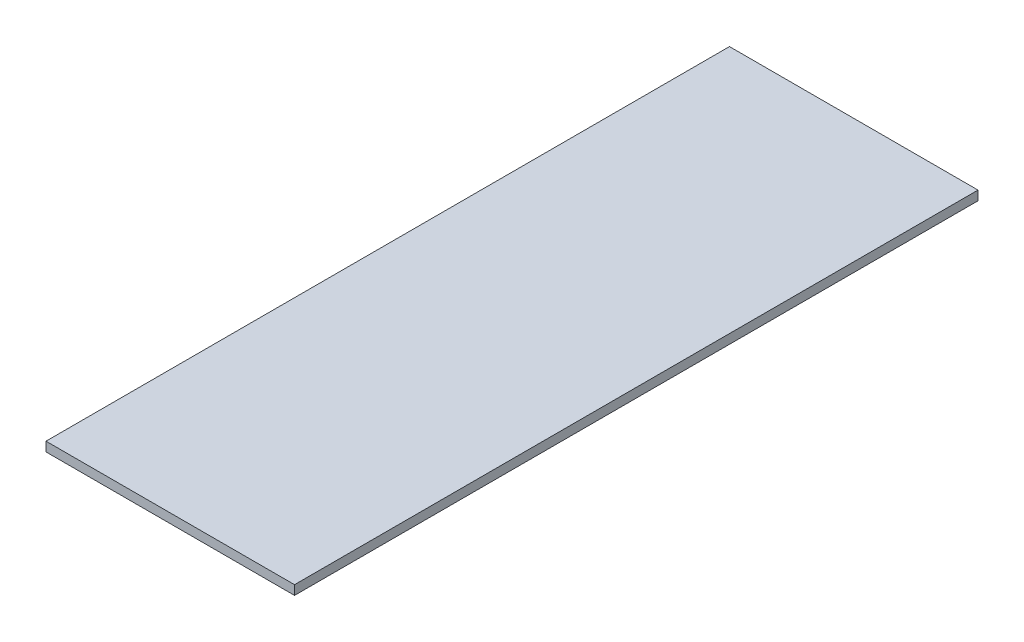
ISO-10303-21;
HEADER;
FILE_DESCRIPTION(('STEP AP214'),'2;1');
FILE_NAME('part.step','',(''),(''),'','','');
FILE_SCHEMA(('AUTOMOTIVE_DESIGN { 1 0 10303 214 1 1 1 1 }'));
ENDSEC;
DATA;
#1=APPLICATION_CONTEXT('core data for automotive mechanical design processes');
#2=APPLICATION_PROTOCOL_DEFINITION('international standard','automotive_design',2000,#1);
#3=PRODUCT_CONTEXT('',#1,'mechanical');
#4=PRODUCT('Part','Part','',(#3));
#5=PRODUCT_RELATED_PRODUCT_CATEGORY('part','',(#4));
#6=PRODUCT_DEFINITION_FORMATION('','',#4);
#7=PRODUCT_DEFINITION_CONTEXT('part definition',#1,'design');
#8=PRODUCT_DEFINITION('design','',#6,#7);
#9=PRODUCT_DEFINITION_SHAPE('','',#8);
#10=(LENGTH_UNIT() NAMED_UNIT(*) SI_UNIT(.MILLI.,.METRE.));
#11=(NAMED_UNIT(*) PLANE_ANGLE_UNIT() SI_UNIT($,.RADIAN.));
#12=(NAMED_UNIT(*) SI_UNIT($,.STERADIAN.) SOLID_ANGLE_UNIT());
#13=UNCERTAINTY_MEASURE_WITH_UNIT(LENGTH_MEASURE(1.E-05),#10,'distance_accuracy_value','');
#14=(GEOMETRIC_REPRESENTATION_CONTEXT(3) GLOBAL_UNCERTAINTY_ASSIGNED_CONTEXT((#13)) GLOBAL_UNIT_ASSIGNED_CONTEXT((#10,
#11,#12)) REPRESENTATION_CONTEXT('',''));
#15=CARTESIAN_POINT('',(0.,0.,0.));
#16=DIRECTION('',(0.,0.,1.));
#17=DIRECTION('',(1.,0.,0.));
#18=AXIS2_PLACEMENT_3D('',#15,#16,#17);
#19=CARTESIAN_POINT('',(-9.42315746069194,0.3,-23.2613636363636));
#20=DIRECTION('',(1.,0.,0.));
#21=DIRECTION('',(0.,0.,-1.));
#22=AXIS2_PLACEMENT_3D('',#19,#20,#21);
#23=PLANE('',#22);
#24=DIRECTION('',(0.,0.,1.));
#25=VECTOR('',#24,1.);
#26=CARTESIAN_POINT('',(-9.42315746069194,0.,-23.2613636363636));
#27=LINE('',#26,#25);
#28=CARTESIAN_POINT('',(-9.42315746069194,0.,-23.2613636363636));
#29=VERTEX_POINT('',#28);
#30=CARTESIAN_POINT('',(-9.42315746069194,0.,-1.26136363636364));
#31=VERTEX_POINT('',#30);
#32=EDGE_CURVE('E96',#29,#31,#27,.T.);
#33=ORIENTED_EDGE('',*,*,#32,.T.);
#34=DIRECTION('',(0.,-1.,0.));
#35=VECTOR('',#34,1.);
#36=CARTESIAN_POINT('',(-9.42315746069194,0.3,-1.26136363636364));
#37=LINE('',#36,#35);
#38=CARTESIAN_POINT('',(-9.42315746069194,0.3,-1.26136363636364));
#39=VERTEX_POINT('',#38);
#40=EDGE_CURVE('E11',#39,#31,#37,.T.);
#41=ORIENTED_EDGE('',*,*,#40,.F.);
#42=DIRECTION('',(0.,0.,1.));
#43=VECTOR('',#42,1.);
#44=CARTESIAN_POINT('',(-9.42315746069194,0.3,-23.2613636363636));
#45=LINE('',#44,#43);
#46=CARTESIAN_POINT('',(-9.42315746069194,0.3,-23.2613636363636));
#47=VERTEX_POINT('',#46);
#48=EDGE_CURVE('E84',#47,#39,#45,.T.);
#49=ORIENTED_EDGE('',*,*,#48,.F.);
#50=DIRECTION('',(0.,-1.,0.));
#51=VECTOR('',#50,1.);
#52=CARTESIAN_POINT('',(-9.42315746069194,0.3,-23.2613636363636));
#53=LINE('',#52,#51);
#54=EDGE_CURVE('E92',#47,#29,#53,.T.);
#55=ORIENTED_EDGE('',*,*,#54,.T.);
#56=EDGE_LOOP('',(#33,#41,#49,#55));
#57=FACE_BOUND('',#56,.T.);
#58=ADVANCED_FACE('F33',(#57),#23,.F.);
#59=CARTESIAN_POINT('',(-9.42315746069194,0.3,-1.26136363636364));
#60=DIRECTION('',(0.,0.,-1.));
#61=DIRECTION('',(-1.,0.,0.));
#62=AXIS2_PLACEMENT_3D('',#59,#60,#61);
#63=PLANE('',#62);
#64=DIRECTION('',(1.,0.,0.));
#65=VECTOR('',#64,1.);
#66=CARTESIAN_POINT('',(-9.42315746069194,0.,-1.26136363636364));
#67=LINE('',#66,#65);
#68=CARTESIAN_POINT('',(-1.42315746069194,0.,-1.26136363636364));
#69=VERTEX_POINT('',#68);
#70=EDGE_CURVE('E88',#31,#69,#67,.T.);
#71=ORIENTED_EDGE('',*,*,#70,.T.);
#72=DIRECTION('',(0.,-1.,0.));
#73=VECTOR('',#72,1.);
#74=CARTESIAN_POINT('',(-1.42315746069194,0.3,-1.26136363636364));
#75=LINE('',#74,#73);
#76=CARTESIAN_POINT('',(-1.42315746069194,0.3,-1.26136363636364));
#77=VERTEX_POINT('',#76);
#78=EDGE_CURVE('E41',#77,#69,#75,.T.);
#79=ORIENTED_EDGE('',*,*,#78,.F.);
#80=DIRECTION('',(1.,0.,0.));
#81=VECTOR('',#80,1.);
#82=CARTESIAN_POINT('',(-9.42315746069194,0.3,-1.26136363636364));
#83=LINE('',#82,#81);
#84=EDGE_CURVE('E79',#39,#77,#83,.T.);
#85=ORIENTED_EDGE('',*,*,#84,.F.);
#86=ORIENTED_EDGE('',*,*,#40,.T.);
#87=EDGE_LOOP('',(#71,#79,#85,#86));
#88=FACE_BOUND('',#87,.T.);
#89=ADVANCED_FACE('F87',(#88),#63,.F.);
#90=CARTESIAN_POINT('',(-1.42315746069195,0.3,-23.2613636363636));
#91=DIRECTION('',(-1.,0.,0.));
#92=DIRECTION('',(0.,0.,1.));
#93=AXIS2_PLACEMENT_3D('',#90,#91,#92);
#94=PLANE('',#93);
#95=DIRECTION('',(0.,0.,-1.));
#96=VECTOR('',#95,1.);
#97=CARTESIAN_POINT('',(-1.42315746069195,0.,-23.2613636363636));
#98=LINE('',#97,#96);
#99=CARTESIAN_POINT('',(-1.42315746069195,0.,-23.2613636363636));
#100=VERTEX_POINT('',#99);
#101=EDGE_CURVE('E66',#69,#100,#98,.T.);
#102=ORIENTED_EDGE('',*,*,#101,.T.);
#103=DIRECTION('',(0.,-1.,0.));
#104=VECTOR('',#103,1.);
#105=CARTESIAN_POINT('',(-1.42315746069195,0.3,-23.2613636363636));
#106=LINE('',#105,#104);
#107=CARTESIAN_POINT('',(-1.42315746069195,0.3,-23.2613636363636));
#108=VERTEX_POINT('',#107);
#109=EDGE_CURVE('E89',#108,#100,#106,.T.);
#110=ORIENTED_EDGE('',*,*,#109,.F.);
#111=DIRECTION('',(0.,0.,-1.));
#112=VECTOR('',#111,1.);
#113=CARTESIAN_POINT('',(-1.42315746069195,0.3,-23.2613636363636));
#114=LINE('',#113,#112);
#115=EDGE_CURVE('E82',#77,#108,#114,.T.);
#116=ORIENTED_EDGE('',*,*,#115,.F.);
#117=ORIENTED_EDGE('',*,*,#78,.T.);
#118=EDGE_LOOP('',(#102,#110,#116,#117));
#119=FACE_BOUND('',#118,.T.);
#120=ADVANCED_FACE('F90',(#119),#94,.F.);
#121=CARTESIAN_POINT('',(-9.42315746069194,0.3,-23.2613636363636));
#122=DIRECTION('',(0.,0.,1.));
#123=DIRECTION('',(1.,0.,0.));
#124=AXIS2_PLACEMENT_3D('',#121,#122,#123);
#125=PLANE('',#124);
#126=DIRECTION('',(-1.,0.,0.));
#127=VECTOR('',#126,1.);
#128=CARTESIAN_POINT('',(-9.42315746069194,0.,-23.2613636363636));
#129=LINE('',#128,#127);
#130=EDGE_CURVE('E72',#100,#29,#129,.T.);
#131=ORIENTED_EDGE('',*,*,#130,.T.);
#132=ORIENTED_EDGE('',*,*,#54,.F.);
#133=DIRECTION('',(-1.,0.,0.));
#134=VECTOR('',#133,1.);
#135=CARTESIAN_POINT('',(-9.42315746069194,0.3,-23.2613636363636));
#136=LINE('',#135,#134);
#137=EDGE_CURVE('E49',#108,#47,#136,.T.);
#138=ORIENTED_EDGE('',*,*,#137,.F.);
#139=ORIENTED_EDGE('',*,*,#109,.T.);
#140=EDGE_LOOP('',(#131,#132,#138,#139));
#141=FACE_BOUND('',#140,.T.);
#142=ADVANCED_FACE('F103',(#141),#125,.F.);
#143=CARTESIAN_POINT('',(0.,0.3,0.));
#144=DIRECTION('',(0.,1.,0.));
#145=DIRECTION('',(0.,0.,1.));
#146=AXIS2_PLACEMENT_3D('',#143,#144,#145);
#147=PLANE('',#146);
#148=ORIENTED_EDGE('',*,*,#48,.T.);
#149=ORIENTED_EDGE('',*,*,#84,.T.);
#150=ORIENTED_EDGE('',*,*,#115,.T.);
#151=ORIENTED_EDGE('',*,*,#137,.T.);
#152=EDGE_LOOP('',(#148,#149,#150,#151));
#153=FACE_BOUND('',#152,.T.);
#154=ADVANCED_FACE('F80',(#153),#147,.T.);
#155=CARTESIAN_POINT('',(0.,0.,0.));
#156=DIRECTION('',(0.,1.,0.));
#157=DIRECTION('',(0.,0.,1.));
#158=AXIS2_PLACEMENT_3D('',#155,#156,#157);
#159=PLANE('',#158);
#160=ORIENTED_EDGE('',*,*,#32,.F.);
#161=ORIENTED_EDGE('',*,*,#130,.F.);
#162=ORIENTED_EDGE('',*,*,#101,.F.);
#163=ORIENTED_EDGE('',*,*,#70,.F.);
#164=EDGE_LOOP('',(#160,#161,#162,#163));
#165=FACE_BOUND('',#164,.T.);
#166=ADVANCED_FACE('F106',(#165),#159,.F.);
#167=CLOSED_SHELL('',(#58,#89,#120,#142,#154,#166));
#168=MANIFOLD_SOLID_BREP('B2',#167);
#169=ADVANCED_BREP_SHAPE_REPRESENTATION('',(#18,#168),#14);
#170=SHAPE_DEFINITION_REPRESENTATION(#9,#169);
ENDSEC;
END-ISO-10303-21;
